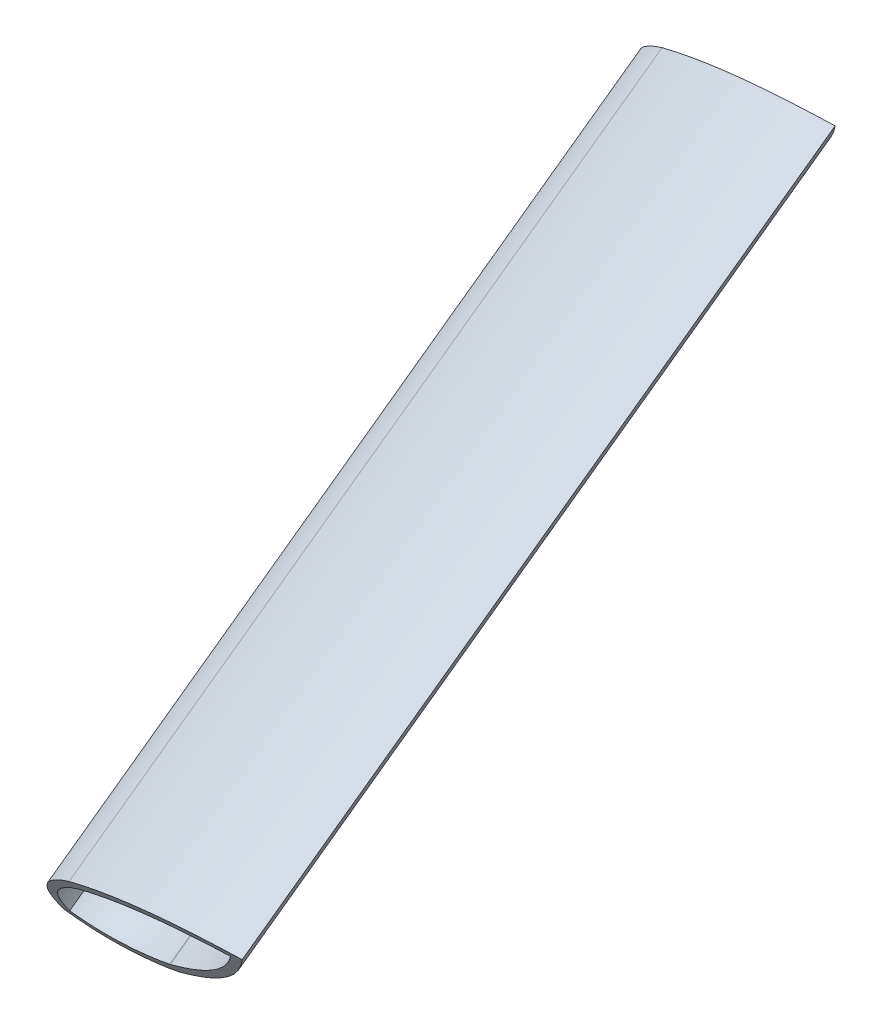
ISO-10303-21;
HEADER;
FILE_DESCRIPTION(('STEP AP214'),'2;1');
FILE_NAME('part.step','',(''),(''),'','','');
FILE_SCHEMA(('AUTOMOTIVE_DESIGN { 1 0 10303 214 1 1 1 1 }'));
ENDSEC;
DATA;
#1=APPLICATION_CONTEXT('core data for automotive mechanical design processes');
#2=APPLICATION_PROTOCOL_DEFINITION('international standard','automotive_design',2000,#1);
#3=PRODUCT_CONTEXT('',#1,'mechanical');
#4=PRODUCT('Part','Part','',(#3));
#5=PRODUCT_RELATED_PRODUCT_CATEGORY('part','',(#4));
#6=PRODUCT_DEFINITION_FORMATION('','',#4);
#7=PRODUCT_DEFINITION_CONTEXT('part definition',#1,'design');
#8=PRODUCT_DEFINITION('design','',#6,#7);
#9=PRODUCT_DEFINITION_SHAPE('','',#8);
#10=(LENGTH_UNIT() NAMED_UNIT(*) SI_UNIT(.MILLI.,.METRE.));
#11=(NAMED_UNIT(*) PLANE_ANGLE_UNIT() SI_UNIT($,.RADIAN.));
#12=(NAMED_UNIT(*) SI_UNIT($,.STERADIAN.) SOLID_ANGLE_UNIT());
#13=UNCERTAINTY_MEASURE_WITH_UNIT(LENGTH_MEASURE(1.E-05),#10,'distance_accuracy_value','');
#14=(GEOMETRIC_REPRESENTATION_CONTEXT(3) GLOBAL_UNCERTAINTY_ASSIGNED_CONTEXT((#13)) GLOBAL_UNIT_ASSIGNED_CONTEXT((#10,
#11,#12)) REPRESENTATION_CONTEXT('',''));
#15=CARTESIAN_POINT('',(0.,0.,0.));
#16=DIRECTION('',(0.,0.,1.));
#17=DIRECTION('',(1.,0.,0.));
#18=AXIS2_PLACEMENT_3D('',#15,#16,#17);
#19=CARTESIAN_POINT('',(-782.230151522592,377.800393529664,371.252433198528));
#20=DIRECTION('',(-0.0147326927785277,0.5661762234603,-0.824152553688773));
#21=DIRECTION('',(0.,0.824242010329109,0.566237678372455));
#22=AXIS2_PLACEMENT_3D('',#19,#20,#21);
#23=PLANE('',#22);
#24=DIRECTION('',(0.859046075895402,0.428966173917692,0.279334675833717));
#25=VECTOR('',#24,1.);
#26=CARTESIAN_POINT('',(-793.883011699565,370.070646178401,366.150560813565));
#27=LINE('',#26,#25);
#28=CARTESIAN_POINT('',(-793.919224615844,370.052563194754,366.138785515925));
#29=VERTEX_POINT('',#28);
#30=CARTESIAN_POINT('',(-793.7345095695,370.144800979104,366.198849020131));
#31=VERTEX_POINT('',#30);
#32=EDGE_CURVE('E304',#29,#31,#27,.T.);
#33=ORIENTED_EDGE('',*,*,#32,.T.);
#34=CARTESIAN_POINT('',(-793.7345095695,370.144800979104,366.198849020131));
#35=CARTESIAN_POINT('',(-791.626166799234,371.210564201992,366.893317814494));
#36=CARTESIAN_POINT('',(-789.604536208493,372.38210799353,367.662005813178));
#37=CARTESIAN_POINT('',(-786.716548419148,374.30206708876,368.929352918046));
#38=CARTESIAN_POINT('',(-785.781086895337,374.966952354484,369.369393247864));
#39=CARTESIAN_POINT('',(-783.9645700621,376.346524411946,370.284659128772));
#40=CARTESIAN_POINT('',(-783.082466540155,377.062137265474,370.760502127653));
#41=CARTESIAN_POINT('',(-780.525521487464,379.276906058044,372.236295340279));
#42=CARTESIAN_POINT('',(-778.9428239694,380.841292393741,373.282704706388));
#43=CARTESIAN_POINT('',(-776.748593303426,383.306766781216,374.937211563581));
#44=CARTESIAN_POINT('',(-776.049317126718,384.145885422419,375.501168806876));
#45=CARTESIAN_POINT('',(-775.046394234541,385.429314942404,376.364930644008));
#46=CARTESIAN_POINT('',(-774.722257583461,385.862598582781,376.656793465303));
#47=CARTESIAN_POINT('',(-774.07409112256,386.72922336318,377.240560518905));
#48=CARTESIAN_POINT('',(-773.750007892109,387.162535753379,377.532444045706));
#49=CARTESIAN_POINT('',(-773.425924661658,387.595848143578,377.824327572507));
#50=B_SPLINE_CURVE_WITH_KNOTS('',3,(#34,#35,#36,#37,#38,#39,#40,#41,#42,#43,#44,#45,#46,#47,#48,
#49),.UNSPECIFIED.,.F.,.F.,(4,2,2,2,2,2,2,4),(0.,0.25000000000001,0.375000000000016,
0.500000000000021,0.750000000000023,0.875000000000016,0.937500000000008,1.),.UNSPECIFIED.);
#51=CARTESIAN_POINT('',(-773.425924661658,387.595848143578,377.824327572507));
#52=VERTEX_POINT('',#51);
#53=EDGE_CURVE('E336',#31,#52,#50,.T.);
#54=ORIENTED_EDGE('',*,*,#53,.T.);
#55=CARTESIAN_POINT('',(-801.550435311085,380.861874400382,373.700981679018));
#56=CARTESIAN_POINT('',(-799.426774066954,381.909359226177,374.382619746644));
#57=CARTESIAN_POINT('',(-797.231453434039,382.845078550873,374.98619616804));
#58=CARTESIAN_POINT('',(-793.831720515613,384.065566401399,375.763872556356));
#59=CARTESIAN_POINT('',(-792.684594587801,384.44078936468,376.001136962755));
#60=CARTESIAN_POINT('',(-790.362575294747,385.128013101495,376.431737027663));
#61=CARTESIAN_POINT('',(-789.186190008492,385.440352341043,376.625278535676));
#62=CARTESIAN_POINT('',(-785.626372469989,386.2799777378,377.138448380533));
#63=CARTESIAN_POINT('',(-783.216283561126,386.709139068981,377.390190417068));
#64=CARTESIAN_POINT('',(-779.558317266366,387.165274975462,377.638156173391));
#65=CARTESIAN_POINT('',(-778.335557074392,387.285645818556,377.698990249416));
#66=CARTESIAN_POINT('',(-776.496496165831,387.420869405136,377.759010763804));
#67=CARTESIAN_POINT('',(-775.882387697525,387.45591888673,377.77211114392));
#68=CARTESIAN_POINT('',(-774.654156179592,387.525883515154,377.798219358213));
#69=CARTESIAN_POINT('',(-774.040040420624,387.560865829366,377.81127346536));
#70=CARTESIAN_POINT('',(-773.425924661658,387.595848143578,377.824327572507));
#71=B_SPLINE_CURVE_WITH_KNOTS('',3,(#55,#56,#57,#58,#59,#60,#61,#62,#63,#64,#65,#66,#67,#68,#69,
#70),.UNSPECIFIED.,.F.,.F.,(4,2,2,2,2,2,2,4),(0.,0.250000000000015,0.375000000000015,
0.500000000000016,0.750000000000002,0.874999999999995,0.937499999999998,1.),.UNSPECIFIED.);
#72=CARTESIAN_POINT('',(-801.550435311085,380.861874400382,373.700981679018));
#73=VERTEX_POINT('',#72);
#74=EDGE_CURVE('E322',#73,#52,#71,.T.);
#75=ORIENTED_EDGE('',*,*,#74,.F.);
#76=CARTESIAN_POINT('',(-801.550435311085,380.861874400382,373.700981679018));
#77=CARTESIAN_POINT('',(-802.141260978462,380.54039054633,373.490690440374));
#78=CARTESIAN_POINT('',(-802.709701053484,380.19597736263,373.264247044872));
#79=CARTESIAN_POINT('',(-803.810618297719,379.470314564484,372.785411487959));
#80=CARTESIAN_POINT('',(-804.343495246704,379.089474440305,372.533307784657));
#81=CARTESIAN_POINT('',(-805.375946766918,378.293682912441,372.005071296275));
#82=CARTESIAN_POINT('',(-805.874205170062,377.880109553505,371.729861672166));
#83=CARTESIAN_POINT('',(-806.814915269047,377.0230398953,371.157888355657));
#84=CARTESIAN_POINT('',(-807.258598462788,376.578316994928,370.860304027444));
#85=CARTESIAN_POINT('',(-808.076057738278,375.64644215131,370.234737800627));
#86=CARTESIAN_POINT('',(-808.450002676284,375.159392692763,369.906829325453));
#87=CARTESIAN_POINT('',(-808.9402373289,374.385918697882,369.38423177126));
#88=CARTESIAN_POINT('',(-809.092560762233,374.119295272851,369.203789802285));
#89=CARTESIAN_POINT('',(-809.365123270175,373.577116801772,368.836196474874));
#90=CARTESIAN_POINT('',(-809.484916735319,373.302837898763,368.649913835241));
#91=CARTESIAN_POINT('',(-809.791573685492,372.469801504378,368.083116444331));
#92=CARTESIAN_POINT('',(-809.925928368749,371.900885851793,367.694684584303));
#93=CARTESIAN_POINT('',(-810.006460944026,371.024104260865,367.093792885255));
#94=CARTESIAN_POINT('',(-810.012723085716,370.729141192096,366.891271134422));
#95=CARTESIAN_POINT('',(-809.983779095031,370.143944020411,366.488735043159));
#96=CARTESIAN_POINT('',(-809.944754117711,369.852437193916,366.287778100906));
#97=CARTESIAN_POINT('',(-809.911686707868,369.560665461513,366.086745672124));
#98=B_SPLINE_CURVE_WITH_KNOTS('',3,(#76,#77,#78,#79,#80,#81,#82,#83,#84,#85,#86,#87,#88,#89,#90,
#91,#92,#93,#94,#95,#96,#97),.UNSPECIFIED.,.F.,.F.,(4,2,2,2,2,2,2,2,2,2,4),(0.,
0.124999999999991,0.249999999999981,0.374999999999972,0.499999999999962,0.624999999999953,
0.687499999999952,0.749999999999951,0.874999999999975,0.937499999999987,1.),.UNSPECIFIED.);
#99=CARTESIAN_POINT('',(-809.911686707868,369.560665461513,366.086745672124));
#100=VERTEX_POINT('',#99);
#101=EDGE_CURVE('E260',#73,#100,#98,.T.);
#102=ORIENTED_EDGE('',*,*,#101,.T.);
#103=CARTESIAN_POINT('',(-793.919224615844,370.052563194754,366.138785515925));
#104=CARTESIAN_POINT('',(-794.547676612772,369.783612769624,365.96525630078));
#105=CARTESIAN_POINT('',(-795.188933926325,369.54144630934,365.810356040666));
#106=CARTESIAN_POINT('',(-796.49291685957,369.102017109137,365.531787244055));
#107=CARTESIAN_POINT('',(-797.155232217199,368.903896253406,365.407521865344));
#108=CARTESIAN_POINT('',(-798.499394844623,368.548508045543,365.187405798792));
#109=CARTESIAN_POINT('',(-799.179106583595,368.39152155597,365.091709882764));
#110=CARTESIAN_POINT('',(-800.542593839813,368.132547336125,364.938173736639));
#111=CARTESIAN_POINT('',(-801.228256914281,368.030282378185,364.88017679901));
#112=CARTESIAN_POINT('',(-802.609858621818,367.897120403642,364.813394951269));
#113=CARTESIAN_POINT('',(-803.305772373826,367.866050577937,364.804490880003));
#114=CARTESIAN_POINT('',(-804.360035602578,367.891626686078,364.840907342513));
#115=CARTESIAN_POINT('',(-804.715252896092,367.912490115969,364.861590024528));
#116=CARTESIAN_POINT('',(-805.419415767134,367.981820051094,364.921806031704));
#117=CARTESIAN_POINT('',(-805.766744604456,368.029977880364,364.961098401562));
#118=CARTESIAN_POINT('',(-806.793532272361,368.217601639336,365.108347182147));
#119=CARTESIAN_POINT('',(-807.457854266494,368.400041797521,365.245555434561));
#120=CARTESIAN_POINT('',(-808.419449826353,368.772749180519,365.518787555864));
#121=CARTESIAN_POINT('',(-808.732703224648,368.913205073469,365.62087770014));
#122=CARTESIAN_POINT('',(-809.33382778615,369.221789003947,365.84361445809));
#123=CARTESIAN_POINT('',(-809.62115409318,369.393314584775,365.966585375714));
#124=CARTESIAN_POINT('',(-809.911686707868,369.560665461513,366.086745672124));
#125=B_SPLINE_CURVE_WITH_KNOTS('',3,(#103,#104,#105,#106,#107,#108,#109,#110,#111,#112,#113,
#114,#115,#116,#117,#118,#119,#120,#121,#122,#123,#124),.UNSPECIFIED.,.F.,.F.,(4,2,2,2,2,2,2,2,
2,2,4),(0.,0.125000000000006,0.250000000000013,0.375000000000019,0.500000000000025,
0.625000000000032,0.687500000000025,0.750000000000018,0.875000000000005,0.937500000000002,1.),.UNSPECIFIED.);
#126=EDGE_CURVE('E252',#29,#100,#125,.T.);
#127=ORIENTED_EDGE('',*,*,#126,.F.);
#128=EDGE_LOOP('',(#33,#54,#75,#102,#127));
#129=FACE_BOUND('',#128,.T.);
#130=DIRECTION('',(0.859046075895409,0.428966173917411,0.279334675834127));
#131=VECTOR('',#130,1.);
#132=CARTESIAN_POINT('',(-794.532853198362,370.964560653236,366.776278751714));
#133=LINE('',#132,#131);
#134=CARTESIAN_POINT('',(-794.532853198362,370.964560653236,366.776278751714));
#135=VERTEX_POINT('',#134);
#136=CARTESIAN_POINT('',(-794.384351068297,371.038715453939,366.82456695828));
#137=VERTEX_POINT('',#136);
#138=EDGE_CURVE('E189',#135,#137,#133,.T.);
#139=ORIENTED_EDGE('',*,*,#138,.F.);
#140=CARTESIAN_POINT('',(-794.532853198362,370.964560653236,366.776278751714));
#141=CARTESIAN_POINT('',(-795.809553215738,370.418187956332,366.423754210343));
#142=CARTESIAN_POINT('',(-800.952500221591,368.755554873098,365.373494937375));
#143=CARTESIAN_POINT('',(-805.935584442202,368.553498319191,365.323764620431));
#144=CARTESIAN_POINT('',(-808.701518201643,370.146715108776,366.467716808875));
#145=B_SPLINE_CURVE_WITH_KNOTS('',3,(#140,#141,#142,#143,#144),.UNSPECIFIED.,.F.,.F.,(4,1,4),
(0.,0.294150135644974,1.),.UNSPECIFIED.);
#146=CARTESIAN_POINT('',(-808.701518201643,370.146715108776,366.467716808875));
#147=VERTEX_POINT('',#146);
#148=EDGE_CURVE('E370',#135,#147,#145,.T.);
#149=ORIENTED_EDGE('',*,*,#148,.T.);
#150=CARTESIAN_POINT('',(-800.882164020112,379.977032048297,373.081166652544));
#151=CARTESIAN_POINT('',(-802.083331352711,379.323445170192,372.653637890442));
#152=CARTESIAN_POINT('',(-806.356453954179,376.426147761439,370.739639935116));
#153=CARTESIAN_POINT('',(-809.016595230642,372.926811010635,368.383219132535));
#154=CARTESIAN_POINT('',(-808.701518201643,370.146715108776,366.467716808875));
#155=B_SPLINE_CURVE_WITH_KNOTS('',3,(#150,#151,#152,#153,#154),.UNSPECIFIED.,.F.,.F.,(4,1,4),
(0.,0.294150135644974,1.),.UNSPECIFIED.);
#156=CARTESIAN_POINT('',(-800.882164020112,379.977032048297,373.081166652544));
#157=VERTEX_POINT('',#156);
#158=EDGE_CURVE('E217',#157,#147,#155,.T.);
#159=ORIENTED_EDGE('',*,*,#158,.F.);
#160=CARTESIAN_POINT('',(-800.882164020112,379.977032048297,373.081166652544));
#161=CARTESIAN_POINT('',(-789.407450754297,385.636874482919,376.764240588507));
#162=CARTESIAN_POINT('',(-775.796256733028,386.412218640925,377.053570381068));
#163=B_SPLINE_CURVE_WITH_KNOTS('',2,(#160,#161,#162),.UNSPECIFIED.,.F.,.F.,(3,3),(0.,1.),.UNSPECIFIED.);
#164=CARTESIAN_POINT('',(-775.796256733028,386.412218640925,377.053570381068));
#165=VERTEX_POINT('',#164);
#166=EDGE_CURVE('E213',#157,#165,#163,.T.);
#167=ORIENTED_EDGE('',*,*,#166,.T.);
#168=CARTESIAN_POINT('',(-794.384351068297,371.038715453939,366.82456695828));
#169=CARTESIAN_POINT('',(-782.984387794147,376.801383115432,370.579616000093));
#170=CARTESIAN_POINT('',(-775.796256733028,386.412218640925,377.053570381068));
#171=B_SPLINE_CURVE_WITH_KNOTS('',2,(#168,#169,#170),.UNSPECIFIED.,.F.,.F.,(3,3),(0.,1.),.UNSPECIFIED.);
#172=EDGE_CURVE('E198',#137,#165,#171,.T.);
#173=ORIENTED_EDGE('',*,*,#172,.F.);
#174=EDGE_LOOP('',(#139,#149,#159,#167,#173));
#175=FACE_BOUND('',#174,.T.);
#176=ADVANCED_FACE('F111',(#129,#175),#23,.F.);
#177=CARTESIAN_POINT('',(-783.726993108882,435.323897833222,287.518533743743));
#178=DIRECTION('',(-0.0147326927785277,0.5661762234603,-0.824152553688773));
#179=DIRECTION('',(0.,0.824242010329109,0.566237678372455));
#180=AXIS2_PLACEMENT_3D('',#177,#178,#179);
#181=PLANE('',#180);
#182=DIRECTION('',(0.859046075895402,0.428966173917692,0.279334675833717));
#183=VECTOR('',#182,1.);
#184=CARTESIAN_POINT('',(-795.379853285855,427.59415048196,282.41666135878));
#185=LINE('',#184,#183);
#186=CARTESIAN_POINT('',(-795.416066202135,427.576067498312,282.40488606114));
#187=VERTEX_POINT('',#186);
#188=CARTESIAN_POINT('',(-795.23135115579,427.668305282663,282.464949565346));
#189=VERTEX_POINT('',#188);
#190=EDGE_CURVE('E207',#187,#189,#185,.T.);
#191=ORIENTED_EDGE('',*,*,#190,.F.);
#192=CARTESIAN_POINT('',(-795.416066202135,427.576067498312,282.40488606114));
#193=CARTESIAN_POINT('',(-796.044518199063,427.307117073183,282.231356845995));
#194=CARTESIAN_POINT('',(-796.685775512616,427.064950612898,282.076456585881));
#195=CARTESIAN_POINT('',(-797.989758445861,426.625521412696,281.79788778927));
#196=CARTESIAN_POINT('',(-798.65207380349,426.427400556965,281.673622410559));
#197=CARTESIAN_POINT('',(-799.996236430913,426.072012349101,281.453506344007));
#198=CARTESIAN_POINT('',(-800.675948169885,425.915025859529,281.357810427979));
#199=CARTESIAN_POINT('',(-802.039435426103,425.656051639684,281.204274281854));
#200=CARTESIAN_POINT('',(-802.725098500572,425.553786681744,281.146277344225));
#201=CARTESIAN_POINT('',(-804.106700208109,425.420624707201,281.079495496484));
#202=CARTESIAN_POINT('',(-804.802613960117,425.389554881496,281.070591425218));
#203=CARTESIAN_POINT('',(-805.856877188869,425.415130989636,281.107007887728));
#204=CARTESIAN_POINT('',(-806.212094482382,425.435994419528,281.127690569743));
#205=CARTESIAN_POINT('',(-806.916257353425,425.505324354653,281.187906576919));
#206=CARTESIAN_POINT('',(-807.263586190747,425.553482183922,281.227198946777));
#207=CARTESIAN_POINT('',(-808.290373858651,425.741105942895,281.374447727362));
#208=CARTESIAN_POINT('',(-808.954695852784,425.92354610108,281.511655979776));
#209=CARTESIAN_POINT('',(-809.916291412643,426.296253484078,281.784888101079));
#210=CARTESIAN_POINT('',(-810.229544810939,426.436709377027,281.886978245355));
#211=CARTESIAN_POINT('',(-810.830669372441,426.745293307505,282.109715003305));
#212=CARTESIAN_POINT('',(-811.11799567947,426.916818888334,282.232685920929));
#213=CARTESIAN_POINT('',(-811.408528294158,427.084169765072,282.352846217339));
#214=B_SPLINE_CURVE_WITH_KNOTS('',3,(#192,#193,#194,#195,#196,#197,#198,#199,#200,#201,#202,
#203,#204,#205,#206,#207,#208,#209,#210,#211,#212,#213),.UNSPECIFIED.,.F.,.F.,(4,2,2,2,2,2,2,2,
2,2,4),(0.,0.125000000000006,0.250000000000013,0.375000000000019,0.500000000000025,
0.625000000000032,0.687500000000025,0.750000000000018,0.875000000000005,0.937500000000002,1.),.UNSPECIFIED.);
#215=CARTESIAN_POINT('',(-811.408528294158,427.084169765072,282.352846217339));
#216=VERTEX_POINT('',#215);
#217=EDGE_CURVE('E295',#187,#216,#214,.T.);
#218=ORIENTED_EDGE('',*,*,#217,.T.);
#219=CARTESIAN_POINT('',(-803.047276897376,438.38537870394,289.967082224233));
#220=CARTESIAN_POINT('',(-803.638102564752,438.063894849889,289.756790985589));
#221=CARTESIAN_POINT('',(-804.206542639775,437.719481666189,289.530347590087));
#222=CARTESIAN_POINT('',(-805.307459884009,436.993818868042,289.051512033175));
#223=CARTESIAN_POINT('',(-805.840336832995,436.612978743863,288.799408329872));
#224=CARTESIAN_POINT('',(-806.872788353209,435.817187216,288.27117184149));
#225=CARTESIAN_POINT('',(-807.371046756353,435.403613857063,287.995962217382));
#226=CARTESIAN_POINT('',(-808.311756855337,434.546544198859,287.423988900873));
#227=CARTESIAN_POINT('',(-808.755440049078,434.101821298487,287.126404572659));
#228=CARTESIAN_POINT('',(-809.572899324568,433.169946454868,286.500838345842));
#229=CARTESIAN_POINT('',(-809.946844262574,432.682896996321,286.172929870668));
#230=CARTESIAN_POINT('',(-810.437078915191,431.90942300144,285.650332316475));
#231=CARTESIAN_POINT('',(-810.589402348524,431.64279957641,285.4698903475));
#232=CARTESIAN_POINT('',(-810.861964856465,431.100621105331,285.102297020089));
#233=CARTESIAN_POINT('',(-810.981758321609,430.826342202321,284.916014380456));
#234=CARTESIAN_POINT('',(-811.288415271782,429.993305807936,284.349216989546));
#235=CARTESIAN_POINT('',(-811.422769955039,429.424390155351,283.960785129518));
#236=CARTESIAN_POINT('',(-811.503302530317,428.547608564423,283.35989343047));
#237=CARTESIAN_POINT('',(-811.509564672007,428.252645495655,283.157371679637));
#238=CARTESIAN_POINT('',(-811.480620681322,427.66744832397,282.754835588374));
#239=CARTESIAN_POINT('',(-811.441595704002,427.375941497475,282.553878646121));
#240=CARTESIAN_POINT('',(-811.408528294158,427.084169765072,282.352846217339));
#241=B_SPLINE_CURVE_WITH_KNOTS('',3,(#219,#220,#221,#222,#223,#224,#225,#226,#227,#228,#229,
#230,#231,#232,#233,#234,#235,#236,#237,#238,#239,#240),.UNSPECIFIED.,.F.,.F.,(4,2,2,2,2,2,2,2,
2,2,4),(0.,0.124999999999991,0.249999999999981,0.374999999999972,0.499999999999962,
0.624999999999953,0.687499999999952,0.749999999999951,0.874999999999975,0.937499999999987,1.),.UNSPECIFIED.);
#242=CARTESIAN_POINT('',(-803.047276897376,438.38537870394,289.967082224233));
#243=VERTEX_POINT('',#242);
#244=EDGE_CURVE('E286',#243,#216,#241,.T.);
#245=ORIENTED_EDGE('',*,*,#244,.F.);
#246=CARTESIAN_POINT('',(-803.047276897376,438.38537870394,289.967082224233));
#247=CARTESIAN_POINT('',(-800.923615653245,439.432863529735,290.648720291859));
#248=CARTESIAN_POINT('',(-798.728295020329,440.368582854431,291.252296713255));
#249=CARTESIAN_POINT('',(-795.328562101904,441.589070704958,292.029973101571));
#250=CARTESIAN_POINT('',(-794.181436174091,441.964293668238,292.26723750797));
#251=CARTESIAN_POINT('',(-791.859416881038,442.651517405053,292.697837572878));
#252=CARTESIAN_POINT('',(-790.683031594783,442.963856644601,292.891379080891));
#253=CARTESIAN_POINT('',(-787.12321405628,443.803482041358,293.404548925748));
#254=CARTESIAN_POINT('',(-784.713125147416,444.23264337254,293.656290962283));
#255=CARTESIAN_POINT('',(-781.055158852656,444.68877927902,293.904256718606));
#256=CARTESIAN_POINT('',(-779.832398660682,444.809150122114,293.965090794631));
#257=CARTESIAN_POINT('',(-777.993337752121,444.944373708695,294.025111309019));
#258=CARTESIAN_POINT('',(-777.379229283816,444.979423190288,294.038211689135));
#259=CARTESIAN_POINT('',(-776.150997765882,445.049387818713,294.064319903428));
#260=CARTESIAN_POINT('',(-775.536882006915,445.084370132925,294.077374010575));
#261=CARTESIAN_POINT('',(-774.922766247948,445.119352447137,294.090428117722));
#262=B_SPLINE_CURVE_WITH_KNOTS('',3,(#246,#247,#248,#249,#250,#251,#252,#253,#254,#255,#256,
#257,#258,#259,#260,#261),.UNSPECIFIED.,.F.,.F.,(4,2,2,2,2,2,2,4),(0.,0.250000000000015,
0.375000000000015,0.500000000000016,0.750000000000002,0.874999999999995,0.937499999999998,1.),.UNSPECIFIED.);
#263=CARTESIAN_POINT('',(-774.922766247949,445.119352447137,294.090428117722));
#264=VERTEX_POINT('',#263);
#265=EDGE_CURVE('E277',#243,#264,#262,.T.);
#266=ORIENTED_EDGE('',*,*,#265,.T.);
#267=CARTESIAN_POINT('',(-795.23135115579,427.668305282663,282.464949565346));
#268=CARTESIAN_POINT('',(-793.123008385524,428.734068505551,283.159418359709));
#269=CARTESIAN_POINT('',(-791.101377794784,429.905612297088,283.928106358393));
#270=CARTESIAN_POINT('',(-788.213390005438,431.825571392318,285.195453463261));
#271=CARTESIAN_POINT('',(-787.277928481627,432.490456658042,285.635493793079));
#272=CARTESIAN_POINT('',(-785.461411648391,433.870028715504,286.550759673987));
#273=CARTESIAN_POINT('',(-784.579308126446,434.585641569033,287.026602672868));
#274=CARTESIAN_POINT('',(-782.022363073754,436.800410361603,288.502395885494));
#275=CARTESIAN_POINT('',(-780.43966555569,438.3647966973,289.548805251603));
#276=CARTESIAN_POINT('',(-778.245434889717,440.830271084774,291.203312108796));
#277=CARTESIAN_POINT('',(-777.546158713008,441.669389725977,291.767269352091));
#278=CARTESIAN_POINT('',(-776.543235820831,442.952819245962,292.631031189223));
#279=CARTESIAN_POINT('',(-776.219099169751,443.38610288634,292.922894010519));
#280=CARTESIAN_POINT('',(-775.57093270885,444.252727666738,293.50666106412));
#281=CARTESIAN_POINT('',(-775.2468494784,444.686040056938,293.798544590921));
#282=CARTESIAN_POINT('',(-774.922766247949,445.119352447137,294.090428117722));
#283=B_SPLINE_CURVE_WITH_KNOTS('',3,(#267,#268,#269,#270,#271,#272,#273,#274,#275,#276,#277,
#278,#279,#280,#281,#282),.UNSPECIFIED.,.F.,.F.,(4,2,2,2,2,2,2,4),(0.,0.25000000000001,
0.375000000000016,0.500000000000021,0.750000000000023,0.875000000000016,0.937500000000008,1.),.UNSPECIFIED.);
#284=EDGE_CURVE('E271',#189,#264,#283,.T.);
#285=ORIENTED_EDGE('',*,*,#284,.F.);
#286=EDGE_LOOP('',(#191,#218,#245,#266,#285));
#287=FACE_BOUND('',#286,.T.);
#288=CARTESIAN_POINT('',(-796.029694784653,428.488064956795,283.042379296929));
#289=CARTESIAN_POINT('',(-797.306394802028,427.94169225989,282.689854755558));
#290=CARTESIAN_POINT('',(-802.449341807882,426.279059176656,281.63959548259));
#291=CARTESIAN_POINT('',(-807.432426028492,426.077002622749,281.589865165646));
#292=CARTESIAN_POINT('',(-810.198359787934,427.670219412335,282.73381735409));
#293=B_SPLINE_CURVE_WITH_KNOTS('',3,(#288,#289,#290,#291,#292),.UNSPECIFIED.,.F.,.F.,(4,1,4),
(0.,0.294150135644974,1.),.UNSPECIFIED.);
#294=CARTESIAN_POINT('',(-796.029694784653,428.488064956794,283.042379296929));
#295=VERTEX_POINT('',#294);
#296=CARTESIAN_POINT('',(-810.198359787934,427.670219412335,282.73381735409));
#297=VERTEX_POINT('',#296);
#298=EDGE_CURVE('E199',#295,#297,#293,.T.);
#299=ORIENTED_EDGE('',*,*,#298,.F.);
#300=DIRECTION('',(0.859046075895409,0.428966173917411,0.279334675834127));
#301=VECTOR('',#300,1.);
#302=CARTESIAN_POINT('',(-796.029694784653,428.488064956795,283.042379296929));
#303=LINE('',#302,#301);
#304=CARTESIAN_POINT('',(-795.881192654587,428.562219757497,283.090667503495));
#305=VERTEX_POINT('',#304);
#306=EDGE_CURVE('E135',#295,#305,#303,.T.);
#307=ORIENTED_EDGE('',*,*,#306,.T.);
#308=CARTESIAN_POINT('',(-795.881192654587,428.562219757497,283.090667503495));
#309=CARTESIAN_POINT('',(-784.481229380437,434.324887418991,286.845716545308));
#310=CARTESIAN_POINT('',(-777.293098319318,443.935722944483,293.319670926284));
#311=B_SPLINE_CURVE_WITH_KNOTS('',2,(#308,#309,#310),.UNSPECIFIED.,.F.,.F.,(3,3),(0.,1.),.UNSPECIFIED.);
#312=CARTESIAN_POINT('',(-777.293098319318,443.935722944483,293.319670926284));
#313=VERTEX_POINT('',#312);
#314=EDGE_CURVE('E205',#305,#313,#311,.T.);
#315=ORIENTED_EDGE('',*,*,#314,.T.);
#316=CARTESIAN_POINT('',(-802.379005606403,437.500536351855,289.347267197759));
#317=CARTESIAN_POINT('',(-790.904292340587,443.160378786478,293.030341133722));
#318=CARTESIAN_POINT('',(-777.293098319318,443.935722944483,293.319670926284));
#319=B_SPLINE_CURVE_WITH_KNOTS('',2,(#316,#317,#318),.UNSPECIFIED.,.F.,.F.,(3,3),(0.,1.),.UNSPECIFIED.);
#320=CARTESIAN_POINT('',(-802.379005606403,437.500536351855,289.347267197759));
#321=VERTEX_POINT('',#320);
#322=EDGE_CURVE('E384',#321,#313,#319,.T.);
#323=ORIENTED_EDGE('',*,*,#322,.F.);
#324=CARTESIAN_POINT('',(-802.379005606403,437.500536351855,289.347267197759));
#325=CARTESIAN_POINT('',(-803.580172939002,436.846949473751,288.919738435657));
#326=CARTESIAN_POINT('',(-807.85329554047,433.949652064997,287.005740480331));
#327=CARTESIAN_POINT('',(-810.513436816932,430.450315314194,284.649319677751));
#328=CARTESIAN_POINT('',(-810.198359787934,427.670219412335,282.73381735409));
#329=B_SPLINE_CURVE_WITH_KNOTS('',3,(#324,#325,#326,#327,#328),.UNSPECIFIED.,.F.,.F.,(4,1,4),
(0.,0.294150135644974,1.),.UNSPECIFIED.);
#330=EDGE_CURVE('E375',#321,#297,#329,.T.);
#331=ORIENTED_EDGE('',*,*,#330,.T.);
#332=EDGE_LOOP('',(#299,#307,#315,#323,#331));
#333=FACE_BOUND('',#332,.T.);
#334=ADVANCED_FACE('F240',(#287,#333),#181,.T.);
#335=CARTESIAN_POINT('',(-793.883011699565,370.070646178401,366.150560813565));
#336=DIRECTION('',(-0.511686219525411,0.703869665224137,0.492691289881458));
#337=DIRECTION('',(-0.808855773889066,-0.588007089282365,0.));
#338=AXIS2_PLACEMENT_3D('',#335,#336,#337);
#339=PLANE('',#338);
#340=ORIENTED_EDGE('',*,*,#190,.T.);
#341=DIRECTION('',(-0.0147326927784492,0.566176223460222,-0.824152553688828));
#342=VECTOR('',#341,1.);
#343=CARTESIAN_POINT('',(-793.7345095695,370.144800979104,366.198849020131));
#344=LINE('',#343,#342);
#345=EDGE_CURVE('E12',#31,#189,#344,.T.);
#346=ORIENTED_EDGE('',*,*,#345,.F.);
#347=ORIENTED_EDGE('',*,*,#32,.F.);
#348=DIRECTION('',(-0.0147326927784492,0.566176223460222,-0.824152553688828));
#349=VECTOR('',#348,1.);
#350=CARTESIAN_POINT('',(-793.919224615844,370.052563194754,366.138785515925));
#351=LINE('',#350,#349);
#352=EDGE_CURVE('E259',#29,#187,#351,.T.);
#353=ORIENTED_EDGE('',*,*,#352,.T.);
#354=EDGE_LOOP('',(#340,#346,#347,#353));
#355=FACE_BOUND('',#354,.T.);
#356=ADVANCED_FACE('F113',(#355),#339,.F.);
#357=DIRECTION('',(-0.0147326927784492,0.566176223460222,-0.824152553688828));
#358=VECTOR('',#357,1.);
#359=SURFACE_OF_LINEAR_EXTRUSION('',#50,#358);
#360=ORIENTED_EDGE('',*,*,#284,.T.);
#361=DIRECTION('',(-0.0147326927784492,0.566176223460222,-0.824152553688828));
#362=VECTOR('',#361,1.);
#363=CARTESIAN_POINT('',(-773.425924661658,387.595848143578,377.824327572507));
#364=LINE('',#363,#362);
#365=EDGE_CURVE('E120',#52,#264,#364,.T.);
#366=ORIENTED_EDGE('',*,*,#365,.F.);
#367=ORIENTED_EDGE('',*,*,#53,.F.);
#368=ORIENTED_EDGE('',*,*,#345,.T.);
#369=EDGE_LOOP('',(#360,#366,#367,#368));
#370=FACE_BOUND('',#369,.T.);
#371=ADVANCED_FACE('F324',(#370),#359,.F.);
#372=DIRECTION('',(-0.0147326927784492,0.566176223460222,-0.824152553688828));
#373=VECTOR('',#372,1.);
#374=SURFACE_OF_LINEAR_EXTRUSION('',#71,#373);
#375=ORIENTED_EDGE('',*,*,#265,.F.);
#376=DIRECTION('',(-0.0147326927784492,0.566176223460222,-0.824152553688828));
#377=VECTOR('',#376,1.);
#378=CARTESIAN_POINT('',(-801.550435311085,380.861874400382,373.700981679018));
#379=LINE('',#378,#377);
#380=EDGE_CURVE('E313',#73,#243,#379,.T.);
#381=ORIENTED_EDGE('',*,*,#380,.F.);
#382=ORIENTED_EDGE('',*,*,#74,.T.);
#383=ORIENTED_EDGE('',*,*,#365,.T.);
#384=EDGE_LOOP('',(#375,#381,#382,#383));
#385=FACE_BOUND('',#384,.T.);
#386=ADVANCED_FACE('F320',(#385),#374,.T.);
#387=DIRECTION('',(-0.0147326927784492,0.566176223460222,-0.824152553688828));
#388=VECTOR('',#387,1.);
#389=SURFACE_OF_LINEAR_EXTRUSION('',#98,#388);
#390=ORIENTED_EDGE('',*,*,#244,.T.);
#391=DIRECTION('',(-0.0147326927784492,0.566176223460222,-0.824152553688828));
#392=VECTOR('',#391,1.);
#393=CARTESIAN_POINT('',(-809.911686707868,369.560665461513,366.086745672124));
#394=LINE('',#393,#392);
#395=EDGE_CURVE('E310',#100,#216,#394,.T.);
#396=ORIENTED_EDGE('',*,*,#395,.F.);
#397=ORIENTED_EDGE('',*,*,#101,.F.);
#398=ORIENTED_EDGE('',*,*,#380,.T.);
#399=EDGE_LOOP('',(#390,#396,#397,#398));
#400=FACE_BOUND('',#399,.T.);
#401=ADVANCED_FACE('F248',(#400),#389,.F.);
#402=DIRECTION('',(-0.0147326927784492,0.566176223460222,-0.824152553688828));
#403=VECTOR('',#402,1.);
#404=SURFACE_OF_LINEAR_EXTRUSION('',#125,#403);
#405=ORIENTED_EDGE('',*,*,#217,.F.);
#406=ORIENTED_EDGE('',*,*,#352,.F.);
#407=ORIENTED_EDGE('',*,*,#126,.T.);
#408=ORIENTED_EDGE('',*,*,#395,.T.);
#409=EDGE_LOOP('',(#405,#406,#407,#408));
#410=FACE_BOUND('',#409,.T.);
#411=ADVANCED_FACE('F237',(#410),#404,.T.);
#412=CARTESIAN_POINT('',(-794.532853198362,370.964560653236,366.776278751714));
#413=DIRECTION('',(-0.511686219525411,0.703869665224137,0.492691289881458));
#414=DIRECTION('',(-0.808855773889066,-0.588007089282365,0.));
#415=AXIS2_PLACEMENT_3D('',#412,#413,#414);
#416=PLANE('',#415);
#417=ORIENTED_EDGE('',*,*,#306,.F.);
#418=DIRECTION('',(-0.0147326927784492,0.566176223460222,-0.824152553688828));
#419=VECTOR('',#418,1.);
#420=CARTESIAN_POINT('',(-794.532853198362,370.964560653236,366.776278751714));
#421=LINE('',#420,#419);
#422=EDGE_CURVE('E193',#135,#295,#421,.T.);
#423=ORIENTED_EDGE('',*,*,#422,.F.);
#424=ORIENTED_EDGE('',*,*,#138,.T.);
#425=DIRECTION('',(-0.0147326927784492,0.566176223460222,-0.824152553688828));
#426=VECTOR('',#425,1.);
#427=CARTESIAN_POINT('',(-794.384351068297,371.038715453939,366.82456695828));
#428=LINE('',#427,#426);
#429=EDGE_CURVE('E192',#137,#305,#428,.T.);
#430=ORIENTED_EDGE('',*,*,#429,.T.);
#431=EDGE_LOOP('',(#417,#423,#424,#430));
#432=FACE_BOUND('',#431,.T.);
#433=ADVANCED_FACE('F191',(#432),#416,.T.);
#434=DIRECTION('',(-0.0147326927784492,0.566176223460222,-0.824152553688828));
#435=VECTOR('',#434,1.);
#436=SURFACE_OF_LINEAR_EXTRUSION('',#171,#435);
#437=ORIENTED_EDGE('',*,*,#314,.F.);
#438=ORIENTED_EDGE('',*,*,#429,.F.);
#439=ORIENTED_EDGE('',*,*,#172,.T.);
#440=DIRECTION('',(-0.0147326927784492,0.566176223460222,-0.824152553688828));
#441=VECTOR('',#440,1.);
#442=CARTESIAN_POINT('',(-775.796256733028,386.412218640925,377.053570381068));
#443=LINE('',#442,#441);
#444=EDGE_CURVE('E208',#165,#313,#443,.T.);
#445=ORIENTED_EDGE('',*,*,#444,.T.);
#446=EDGE_LOOP('',(#437,#438,#439,#445));
#447=FACE_BOUND('',#446,.T.);
#448=ADVANCED_FACE('F202',(#447),#436,.T.);
#449=DIRECTION('',(-0.0147326927784492,0.566176223460222,-0.824152553688828));
#450=VECTOR('',#449,1.);
#451=SURFACE_OF_LINEAR_EXTRUSION('',#163,#450);
#452=ORIENTED_EDGE('',*,*,#322,.T.);
#453=ORIENTED_EDGE('',*,*,#444,.F.);
#454=ORIENTED_EDGE('',*,*,#166,.F.);
#455=DIRECTION('',(-0.0147326927784492,0.566176223460222,-0.824152553688828));
#456=VECTOR('',#455,1.);
#457=CARTESIAN_POINT('',(-800.882164020112,379.977032048297,373.081166652544));
#458=LINE('',#457,#456);
#459=EDGE_CURVE('E363',#157,#321,#458,.T.);
#460=ORIENTED_EDGE('',*,*,#459,.T.);
#461=EDGE_LOOP('',(#452,#453,#454,#460));
#462=FACE_BOUND('',#461,.T.);
#463=ADVANCED_FACE('F233',(#462),#451,.F.);
#464=DIRECTION('',(-0.0147326927784492,0.566176223460222,-0.824152553688828));
#465=VECTOR('',#464,1.);
#466=SURFACE_OF_LINEAR_EXTRUSION('',#155,#465);
#467=ORIENTED_EDGE('',*,*,#330,.F.);
#468=ORIENTED_EDGE('',*,*,#459,.F.);
#469=ORIENTED_EDGE('',*,*,#158,.T.);
#470=DIRECTION('',(-0.0147326927784492,0.566176223460222,-0.824152553688828));
#471=VECTOR('',#470,1.);
#472=CARTESIAN_POINT('',(-808.701518201643,370.146715108776,366.467716808875));
#473=LINE('',#472,#471);
#474=EDGE_CURVE('E127',#147,#297,#473,.T.);
#475=ORIENTED_EDGE('',*,*,#474,.T.);
#476=EDGE_LOOP('',(#467,#468,#469,#475));
#477=FACE_BOUND('',#476,.T.);
#478=ADVANCED_FACE('F418',(#477),#466,.T.);
#479=DIRECTION('',(-0.0147326927784492,0.566176223460222,-0.824152553688828));
#480=VECTOR('',#479,1.);
#481=SURFACE_OF_LINEAR_EXTRUSION('',#145,#480);
#482=ORIENTED_EDGE('',*,*,#298,.T.);
#483=ORIENTED_EDGE('',*,*,#474,.F.);
#484=ORIENTED_EDGE('',*,*,#148,.F.);
#485=ORIENTED_EDGE('',*,*,#422,.T.);
#486=EDGE_LOOP('',(#482,#483,#484,#485));
#487=FACE_BOUND('',#486,.T.);
#488=ADVANCED_FACE('F416',(#487),#481,.F.);
#489=CLOSED_SHELL('',(#176,#334,#356,#371,#386,#401,#411,#433,#448,#463,#478,#488));
#490=MANIFOLD_SOLID_BREP('B2',#489);
#491=ADVANCED_BREP_SHAPE_REPRESENTATION('',(#18,#490),#14);
#492=SHAPE_DEFINITION_REPRESENTATION(#9,#491);
ENDSEC;
END-ISO-10303-21;
